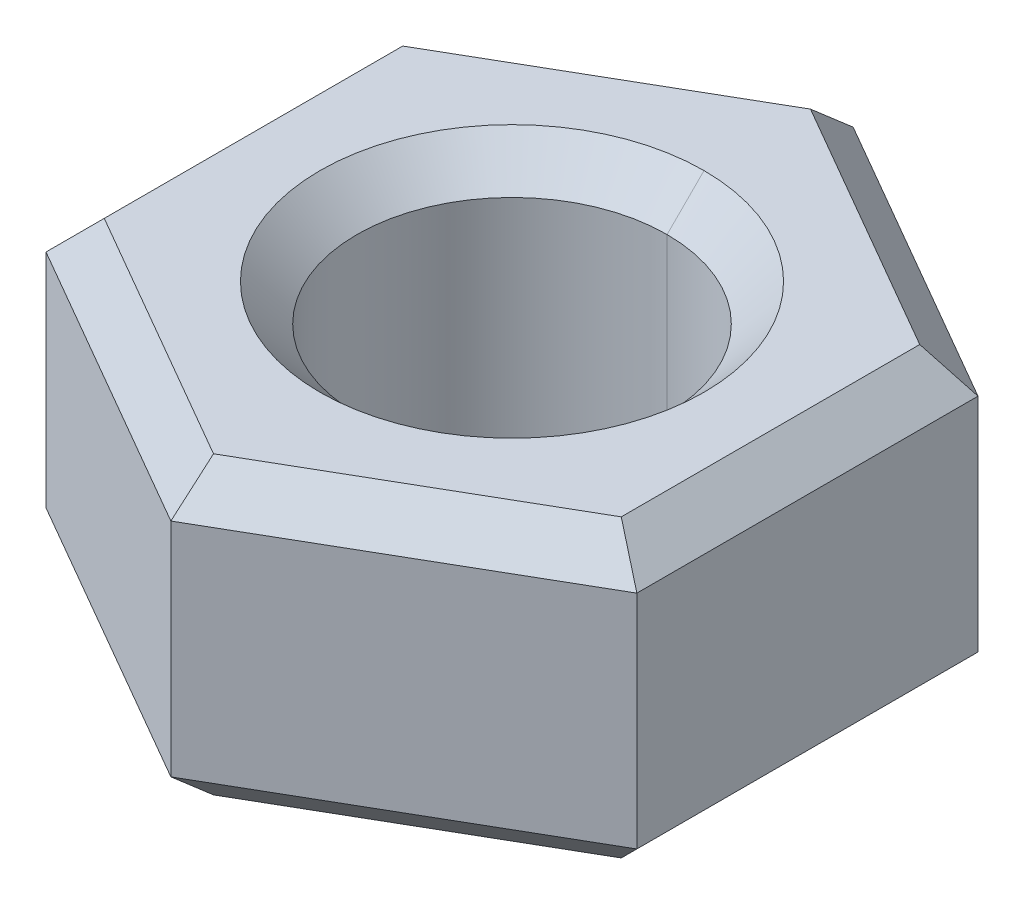
ISO-10303-21;
HEADER;
FILE_DESCRIPTION(('STEP AP214'),'2;1');
FILE_NAME('part.step','',(''),(''),'','','');
FILE_SCHEMA(('AUTOMOTIVE_DESIGN { 1 0 10303 214 1 1 1 1 }'));
ENDSEC;
DATA;
#1=APPLICATION_CONTEXT('core data for automotive mechanical design processes');
#2=APPLICATION_PROTOCOL_DEFINITION('international standard','automotive_design',2000,#1);
#3=PRODUCT_CONTEXT('',#1,'mechanical');
#4=PRODUCT('Part','Part','',(#3));
#5=PRODUCT_RELATED_PRODUCT_CATEGORY('part','',(#4));
#6=PRODUCT_DEFINITION_FORMATION('','',#4);
#7=PRODUCT_DEFINITION_CONTEXT('part definition',#1,'design');
#8=PRODUCT_DEFINITION('design','',#6,#7);
#9=PRODUCT_DEFINITION_SHAPE('','',#8);
#10=(LENGTH_UNIT() NAMED_UNIT(*) SI_UNIT(.MILLI.,.METRE.));
#11=(NAMED_UNIT(*) PLANE_ANGLE_UNIT() SI_UNIT($,.RADIAN.));
#12=(NAMED_UNIT(*) SI_UNIT($,.STERADIAN.) SOLID_ANGLE_UNIT());
#13=UNCERTAINTY_MEASURE_WITH_UNIT(LENGTH_MEASURE(1.E-05),#10,'distance_accuracy_value','');
#14=(GEOMETRIC_REPRESENTATION_CONTEXT(3) GLOBAL_UNCERTAINTY_ASSIGNED_CONTEXT((#13)) GLOBAL_UNIT_ASSIGNED_CONTEXT((#10,
#11,#12)) REPRESENTATION_CONTEXT('',''));
#15=CARTESIAN_POINT('',(0.,0.,0.));
#16=DIRECTION('',(0.,0.,1.));
#17=DIRECTION('',(1.,0.,0.));
#18=AXIS2_PLACEMENT_3D('',#15,#16,#17);
#19=CARTESIAN_POINT('',(0.,4.,-4.61880215351701));
#20=DIRECTION('',(0.,1.,0.));
#21=DIRECTION('',(0.,0.,1.));
#22=AXIS2_PLACEMENT_3D('',#19,#20,#21);
#23=PLANE('',#22);
#24=CARTESIAN_POINT('',(0.,4.00000000007594,0.));
#25=DIRECTION('',(0.,1.,0.));
#26=DIRECTION('',(0.,0.,1.));
#27=AXIS2_PLACEMENT_3D('',#24,#25,#26);
#28=CIRCLE('',#27,2.59999999997262);
#29=CARTESIAN_POINT('',(0.,4.00000000007594,2.59999999997262));
#30=VERTEX_POINT('',#29);
#31=CARTESIAN_POINT('',(0.,4.00000000007594,-2.59999999997262));
#32=VERTEX_POINT('',#31);
#33=EDGE_CURVE('E20',#30,#32,#28,.F.);
#34=ORIENTED_EDGE('',*,*,#33,.T.);
#35=CARTESIAN_POINT('',(0.,4.00000000007594,0.));
#36=DIRECTION('',(0.,1.,0.));
#37=DIRECTION('',(0.,0.,1.));
#38=AXIS2_PLACEMENT_3D('',#35,#36,#37);
#39=CIRCLE('',#38,2.59999999997262);
#40=EDGE_CURVE('E56',#32,#30,#39,.F.);
#41=ORIENTED_EDGE('',*,*,#40,.T.);
#42=EDGE_LOOP('',(#34,#41));
#43=FACE_BOUND('',#42,.T.);
#44=DIRECTION('',(0.866025403784439,0.,0.5));
#45=VECTOR('',#44,1.);
#46=CARTESIAN_POINT('',(0.,4.,-4.04145188432738));
#47=LINE('',#46,#45);
#48=CARTESIAN_POINT('',(0.,4.,-4.04145188432738));
#49=VERTEX_POINT('',#48);
#50=CARTESIAN_POINT('',(3.5,4.,-2.02072594216369));
#51=VERTEX_POINT('',#50);
#52=EDGE_CURVE('E266',#49,#51,#47,.T.);
#53=ORIENTED_EDGE('',*,*,#52,.F.);
#54=DIRECTION('',(0.866025403784439,0.,-0.5));
#55=VECTOR('',#54,1.);
#56=CARTESIAN_POINT('',(-3.5,4.,-2.02072594216369));
#57=LINE('',#56,#55);
#58=CARTESIAN_POINT('',(-3.5,4.,-2.02072594216369));
#59=VERTEX_POINT('',#58);
#60=EDGE_CURVE('E259',#59,#49,#57,.T.);
#61=ORIENTED_EDGE('',*,*,#60,.F.);
#62=DIRECTION('',(0.,0.,1.));
#63=VECTOR('',#62,1.);
#64=CARTESIAN_POINT('',(-3.5,4.,-4.61880215351701));
#65=LINE('',#64,#63);
#66=CARTESIAN_POINT('',(-3.5,4.,2.02072594216369));
#67=VERTEX_POINT('',#66);
#68=EDGE_CURVE('E64',#67,#59,#65,.F.);
#69=ORIENTED_EDGE('',*,*,#68,.F.);
#70=DIRECTION('',(-0.866025403784439,0.,-0.5));
#71=VECTOR('',#70,1.);
#72=CARTESIAN_POINT('',(0.,4.,4.04145188432738));
#73=LINE('',#72,#71);
#74=CARTESIAN_POINT('',(0.,4.,4.04145188432738));
#75=VERTEX_POINT('',#74);
#76=EDGE_CURVE('E281',#75,#67,#73,.T.);
#77=ORIENTED_EDGE('',*,*,#76,.F.);
#78=DIRECTION('',(-0.866025403784439,0.,0.5));
#79=VECTOR('',#78,1.);
#80=CARTESIAN_POINT('',(3.5,4.,2.02072594216369));
#81=LINE('',#80,#79);
#82=CARTESIAN_POINT('',(3.5,4.,2.02072594216369));
#83=VERTEX_POINT('',#82);
#84=EDGE_CURVE('E277',#83,#75,#81,.T.);
#85=ORIENTED_EDGE('',*,*,#84,.F.);
#86=DIRECTION('',(0.,0.,1.));
#87=VECTOR('',#86,1.);
#88=CARTESIAN_POINT('',(3.5,4.,-4.61880215351701));
#89=LINE('',#88,#87);
#90=EDGE_CURVE('E273',#51,#83,#89,.T.);
#91=ORIENTED_EDGE('',*,*,#90,.F.);
#92=EDGE_LOOP('',(#53,#61,#69,#77,#85,#91));
#93=FACE_BOUND('',#92,.T.);
#94=ADVANCED_FACE('F17',(#43,#93),#23,.T.);
#95=CARTESIAN_POINT('',(-3.5,4.,-4.61880215351701));
#96=DIRECTION('',(-0.707106781186549,0.707106781186546,0.));
#97=DIRECTION('',(-0.707106781186546,-0.707106781186549,0.));
#98=AXIS2_PLACEMENT_3D('',#95,#96,#97);
#99=PLANE('',#98);
#100=DIRECTION('',(0.654653670707976,0.654653670707978,0.377964473009228));
#101=VECTOR('',#100,1.);
#102=CARTESIAN_POINT('',(-4.,3.5,-2.30940107675851));
#103=LINE('',#102,#101);
#104=CARTESIAN_POINT('',(-4.,3.5,-2.30940107675851));
#105=VERTEX_POINT('',#104);
#106=EDGE_CURVE('E262',#105,#59,#103,.T.);
#107=ORIENTED_EDGE('',*,*,#106,.F.);
#108=DIRECTION('',(0.,0.,-1.));
#109=VECTOR('',#108,1.);
#110=CARTESIAN_POINT('',(-4.,3.5,-2.3094010767585));
#111=LINE('',#110,#109);
#112=CARTESIAN_POINT('',(-4.,3.5,2.3094010767585));
#113=VERTEX_POINT('',#112);
#114=EDGE_CURVE('E241',#105,#113,#111,.F.);
#115=ORIENTED_EDGE('',*,*,#114,.T.);
#116=DIRECTION('',(-0.654653670707976,-0.654653670707978,0.377964473009227));
#117=VECTOR('',#116,1.);
#118=CARTESIAN_POINT('',(-3.5,4.,2.02072594216369));
#119=LINE('',#118,#117);
#120=EDGE_CURVE('E279',#67,#113,#119,.T.);
#121=ORIENTED_EDGE('',*,*,#120,.F.);
#122=ORIENTED_EDGE('',*,*,#68,.T.);
#123=EDGE_LOOP('',(#107,#115,#121,#122));
#124=FACE_BOUND('',#123,.T.);
#125=ADVANCED_FACE('F412',(#124),#99,.T.);
#126=CARTESIAN_POINT('',(-3.75,4.,1.87638837486628));
#127=DIRECTION('',(-0.353553390593274,0.707106781186546,0.612372435695796));
#128=DIRECTION('',(0.,-0.654653670707978,0.755928946018453));
#129=AXIS2_PLACEMENT_3D('',#126,#127,#128);
#130=PLANE('',#129);
#131=ORIENTED_EDGE('',*,*,#120,.T.);
#132=DIRECTION('',(-0.866025403784439,0.,-0.5));
#133=VECTOR('',#132,1.);
#134=CARTESIAN_POINT('',(-4.,3.5,2.3094010767585));
#135=LINE('',#134,#133);
#136=CARTESIAN_POINT('',(0.,3.5,4.61880215351701));
#137=VERTEX_POINT('',#136);
#138=EDGE_CURVE('E237',#113,#137,#135,.F.);
#139=ORIENTED_EDGE('',*,*,#138,.T.);
#140=DIRECTION('',(0.,-0.654653670707978,0.755928946018454));
#141=VECTOR('',#140,1.);
#142=CARTESIAN_POINT('',(0.,5.07142857142857,2.8042727360639));
#143=LINE('',#142,#141);
#144=EDGE_CURVE('E275',#75,#137,#143,.T.);
#145=ORIENTED_EDGE('',*,*,#144,.F.);
#146=ORIENTED_EDGE('',*,*,#76,.T.);
#147=EDGE_LOOP('',(#131,#139,#145,#146));
#148=FACE_BOUND('',#147,.T.);
#149=ADVANCED_FACE('F409',(#148),#130,.T.);
#150=CARTESIAN_POINT('',(3.75,4.,1.87638837486628));
#151=DIRECTION('',(0.353553390593274,0.707106781186547,0.612372435695795));
#152=DIRECTION('',(0.,-0.654653670707978,0.755928946018454));
#153=AXIS2_PLACEMENT_3D('',#150,#151,#152);
#154=PLANE('',#153);
#155=ORIENTED_EDGE('',*,*,#144,.T.);
#156=DIRECTION('',(-0.866025403784439,0.,0.5));
#157=VECTOR('',#156,1.);
#158=CARTESIAN_POINT('',(0.,3.5,4.61880215351701));
#159=LINE('',#158,#157);
#160=CARTESIAN_POINT('',(4.,3.5,2.3094010767585));
#161=VERTEX_POINT('',#160);
#162=EDGE_CURVE('E166',#137,#161,#159,.F.);
#163=ORIENTED_EDGE('',*,*,#162,.T.);
#164=DIRECTION('',(0.654653670707976,-0.654653670707978,0.377964473009227));
#165=VECTOR('',#164,1.);
#166=CARTESIAN_POINT('',(3.5,4.,2.02072594216369));
#167=LINE('',#166,#165);
#168=EDGE_CURVE('E271',#83,#161,#167,.T.);
#169=ORIENTED_EDGE('',*,*,#168,.F.);
#170=ORIENTED_EDGE('',*,*,#84,.T.);
#171=EDGE_LOOP('',(#155,#163,#169,#170));
#172=FACE_BOUND('',#171,.T.);
#173=ADVANCED_FACE('F405',(#172),#154,.T.);
#174=CARTESIAN_POINT('',(3.5,4.,-4.61880215351701));
#175=DIRECTION('',(0.707106781186549,0.707106781186546,0.));
#176=DIRECTION('',(-0.707106781186546,0.707106781186549,0.));
#177=AXIS2_PLACEMENT_3D('',#174,#175,#176);
#178=PLANE('',#177);
#179=ORIENTED_EDGE('',*,*,#168,.T.);
#180=DIRECTION('',(0.,0.,1.));
#181=VECTOR('',#180,1.);
#182=CARTESIAN_POINT('',(4.,3.5,2.3094010767585));
#183=LINE('',#182,#181);
#184=CARTESIAN_POINT('',(4.,3.5,-2.3094010767585));
#185=VERTEX_POINT('',#184);
#186=EDGE_CURVE('E163',#161,#185,#183,.F.);
#187=ORIENTED_EDGE('',*,*,#186,.T.);
#188=DIRECTION('',(0.654653670707977,-0.654653670707978,-0.377964473009227));
#189=VECTOR('',#188,1.);
#190=CARTESIAN_POINT('',(3.5,4.,-2.02072594216369));
#191=LINE('',#190,#189);
#192=EDGE_CURVE('E269',#51,#185,#191,.T.);
#193=ORIENTED_EDGE('',*,*,#192,.F.);
#194=ORIENTED_EDGE('',*,*,#90,.T.);
#195=EDGE_LOOP('',(#179,#187,#193,#194));
#196=FACE_BOUND('',#195,.T.);
#197=ADVANCED_FACE('F401',(#196),#178,.T.);
#198=CARTESIAN_POINT('',(-0.25,4.,-4.18578945162479));
#199=DIRECTION('',(0.353553390593275,0.707106781186546,-0.612372435695796));
#200=DIRECTION('',(0.,0.654653670707979,0.755928946018453));
#201=AXIS2_PLACEMENT_3D('',#198,#199,#200);
#202=PLANE('',#201);
#203=DIRECTION('',(0.,0.654653670707978,0.755928946018454));
#204=VECTOR('',#203,1.);
#205=CARTESIAN_POINT('',(0.,3.92857142857143,-4.12393049421161));
#206=LINE('',#205,#204);
#207=CARTESIAN_POINT('',(0.,3.5,-4.61880215351701));
#208=VERTEX_POINT('',#207);
#209=EDGE_CURVE('E264',#49,#208,#206,.F.);
#210=ORIENTED_EDGE('',*,*,#209,.F.);
#211=ORIENTED_EDGE('',*,*,#52,.T.);
#212=ORIENTED_EDGE('',*,*,#192,.T.);
#213=DIRECTION('',(0.866025403784439,0.,0.5));
#214=VECTOR('',#213,1.);
#215=CARTESIAN_POINT('',(4.,3.5,-2.3094010767585));
#216=LINE('',#215,#214);
#217=EDGE_CURVE('E228',#185,#208,#216,.F.);
#218=ORIENTED_EDGE('',*,*,#217,.T.);
#219=EDGE_LOOP('',(#210,#211,#212,#218));
#220=FACE_BOUND('',#219,.T.);
#221=ADVANCED_FACE('F397',(#220),#202,.T.);
#222=CARTESIAN_POINT('',(0.250000000000002,4.,-4.18578945162479));
#223=DIRECTION('',(-0.353553390593274,0.707106781186547,-0.612372435695795));
#224=DIRECTION('',(0.,0.654653670707978,0.755928946018454));
#225=AXIS2_PLACEMENT_3D('',#222,#223,#224);
#226=PLANE('',#225);
#227=ORIENTED_EDGE('',*,*,#106,.T.);
#228=ORIENTED_EDGE('',*,*,#60,.T.);
#229=ORIENTED_EDGE('',*,*,#209,.T.);
#230=DIRECTION('',(0.866025403784439,0.,-0.5));
#231=VECTOR('',#230,1.);
#232=CARTESIAN_POINT('',(0.,3.5,-4.61880215351701));
#233=LINE('',#232,#231);
#234=EDGE_CURVE('E222',#208,#105,#233,.F.);
#235=ORIENTED_EDGE('',*,*,#234,.T.);
#236=EDGE_LOOP('',(#227,#228,#229,#235));
#237=FACE_BOUND('',#236,.T.);
#238=ADVANCED_FACE('F394',(#237),#226,.T.);
#239=CARTESIAN_POINT('',(0.,4.00000000007594,0.));
#240=DIRECTION('',(0.,1.,0.));
#241=DIRECTION('',(0.,0.,1.));
#242=AXIS2_PLACEMENT_3D('',#239,#240,#241);
#243=CONICAL_SURFACE('',#242,2.59999999997262,0.785398163397448);
#244=DIRECTION('',(0.,-0.707106781186548,0.707106781186547));
#245=VECTOR('',#244,1.);
#246=CARTESIAN_POINT('',(6.1109703826901E-11,499000.,-498998.6));
#247=LINE('',#246,#245);
#248=CARTESIAN_POINT('',(0.,3.49999999999352,-2.0999999999819));
#249=VERTEX_POINT('',#248);
#250=EDGE_CURVE('E244',#249,#32,#247,.F.);
#251=ORIENTED_EDGE('',*,*,#250,.T.);
#252=ORIENTED_EDGE('',*,*,#33,.F.);
#253=DIRECTION('',(0.,-0.707106781186548,-0.707106781186547));
#254=VECTOR('',#253,1.);
#255=CARTESIAN_POINT('',(0.,499000.,498998.6));
#256=LINE('',#255,#254);
#257=CARTESIAN_POINT('',(0.,3.50000000002194,2.09999999999611));
#258=VERTEX_POINT('',#257);
#259=EDGE_CURVE('E252',#30,#258,#256,.T.);
#260=ORIENTED_EDGE('',*,*,#259,.T.);
#261=CARTESIAN_POINT('',(0.,3.5,0.));
#262=DIRECTION('',(0.,-1.,0.));
#263=DIRECTION('',(0.,0.,-1.));
#264=AXIS2_PLACEMENT_3D('',#261,#262,#263);
#265=CIRCLE('',#264,2.1);
#266=EDGE_CURVE('E93',#258,#249,#265,.T.);
#267=ORIENTED_EDGE('',*,*,#266,.T.);
#268=EDGE_LOOP('',(#251,#252,#260,#267));
#269=FACE_BOUND('',#268,.T.);
#270=ADVANCED_FACE('F288',(#269),#243,.F.);
#271=CARTESIAN_POINT('',(0.,4.00000000007594,0.));
#272=DIRECTION('',(0.,1.,0.));
#273=DIRECTION('',(0.,0.,1.));
#274=AXIS2_PLACEMENT_3D('',#271,#272,#273);
#275=CONICAL_SURFACE('',#274,2.59999999997262,0.785398163397448);
#276=CARTESIAN_POINT('',(0.,3.5,0.));
#277=DIRECTION('',(0.,-1.,0.));
#278=DIRECTION('',(0.,0.,-1.));
#279=AXIS2_PLACEMENT_3D('',#276,#277,#278);
#280=CIRCLE('',#279,2.1);
#281=EDGE_CURVE('E214',#249,#258,#280,.T.);
#282=ORIENTED_EDGE('',*,*,#281,.T.);
#283=ORIENTED_EDGE('',*,*,#259,.F.);
#284=ORIENTED_EDGE('',*,*,#40,.F.);
#285=ORIENTED_EDGE('',*,*,#250,.F.);
#286=EDGE_LOOP('',(#282,#283,#284,#285));
#287=FACE_BOUND('',#286,.T.);
#288=ADVANCED_FACE('F289',(#287),#275,.F.);
#289=CARTESIAN_POINT('',(-4.,4.,-2.3094010767585));
#290=DIRECTION('',(1.,0.,0.));
#291=DIRECTION('',(0.,0.,-1.));
#292=AXIS2_PLACEMENT_3D('',#289,#290,#291);
#293=PLANE('',#292);
#294=DIRECTION('',(0.,1.,0.));
#295=VECTOR('',#294,1.);
#296=CARTESIAN_POINT('',(-4.,4.,2.3094010767585));
#297=LINE('',#296,#295);
#298=CARTESIAN_POINT('',(-4.,0.499999999999999,2.30940107675851));
#299=VERTEX_POINT('',#298);
#300=EDGE_CURVE('E101',#299,#113,#297,.T.);
#301=ORIENTED_EDGE('',*,*,#300,.T.);
#302=ORIENTED_EDGE('',*,*,#114,.F.);
#303=DIRECTION('',(0.,1.,0.));
#304=VECTOR('',#303,1.);
#305=CARTESIAN_POINT('',(-4.,4.,-2.30940107675851));
#306=LINE('',#305,#304);
#307=CARTESIAN_POINT('',(-4.,0.499999999999999,-2.30940107675851));
#308=VERTEX_POINT('',#307);
#309=EDGE_CURVE('E220',#105,#308,#306,.F.);
#310=ORIENTED_EDGE('',*,*,#309,.T.);
#311=DIRECTION('',(0.,0.,1.));
#312=VECTOR('',#311,1.);
#313=CARTESIAN_POINT('',(-4.,0.499999999999999,-2.3094010767585));
#314=LINE('',#313,#312);
#315=EDGE_CURVE('E142',#308,#299,#314,.T.);
#316=ORIENTED_EDGE('',*,*,#315,.T.);
#317=EDGE_LOOP('',(#301,#302,#310,#316));
#318=FACE_BOUND('',#317,.T.);
#319=ADVANCED_FACE('F386',(#318),#293,.F.);
#320=CARTESIAN_POINT('',(-4.,4.,2.3094010767585));
#321=DIRECTION('',(0.5,0.,-0.866025403784439));
#322=DIRECTION('',(-0.866025403784439,0.,-0.5));
#323=AXIS2_PLACEMENT_3D('',#320,#321,#322);
#324=PLANE('',#323);
#325=DIRECTION('',(0.,1.,0.));
#326=VECTOR('',#325,1.);
#327=CARTESIAN_POINT('',(0.,4.,4.61880215351701));
#328=LINE('',#327,#326);
#329=CARTESIAN_POINT('',(0.,0.499999999999999,4.61880215351701));
#330=VERTEX_POINT('',#329);
#331=EDGE_CURVE('E172',#330,#137,#328,.T.);
#332=ORIENTED_EDGE('',*,*,#331,.T.);
#333=ORIENTED_EDGE('',*,*,#138,.F.);
#334=ORIENTED_EDGE('',*,*,#300,.F.);
#335=DIRECTION('',(0.866025403784439,0.,0.5));
#336=VECTOR('',#335,1.);
#337=CARTESIAN_POINT('',(-4.,0.499999999999999,2.3094010767585));
#338=LINE('',#337,#336);
#339=EDGE_CURVE('E198',#299,#330,#338,.T.);
#340=ORIENTED_EDGE('',*,*,#339,.T.);
#341=EDGE_LOOP('',(#332,#333,#334,#340));
#342=FACE_BOUND('',#341,.T.);
#343=ADVANCED_FACE('F383',(#342),#324,.F.);
#344=CARTESIAN_POINT('',(0.,4.,4.61880215351701));
#345=DIRECTION('',(-0.5,0.,-0.866025403784439));
#346=DIRECTION('',(-0.866025403784439,0.,0.5));
#347=AXIS2_PLACEMENT_3D('',#344,#345,#346);
#348=PLANE('',#347);
#349=DIRECTION('',(0.,1.,0.));
#350=VECTOR('',#349,1.);
#351=CARTESIAN_POINT('',(4.,4.,2.3094010767585));
#352=LINE('',#351,#350);
#353=CARTESIAN_POINT('',(4.,0.499999999999999,2.30940107675851));
#354=VERTEX_POINT('',#353);
#355=EDGE_CURVE('E155',#354,#161,#352,.T.);
#356=ORIENTED_EDGE('',*,*,#355,.T.);
#357=ORIENTED_EDGE('',*,*,#162,.F.);
#358=ORIENTED_EDGE('',*,*,#331,.F.);
#359=DIRECTION('',(0.866025403784439,0.,-0.5));
#360=VECTOR('',#359,1.);
#361=CARTESIAN_POINT('',(0.,0.499999999999998,4.61880215351701));
#362=LINE('',#361,#360);
#363=EDGE_CURVE('E169',#330,#354,#362,.T.);
#364=ORIENTED_EDGE('',*,*,#363,.T.);
#365=EDGE_LOOP('',(#356,#357,#358,#364));
#366=FACE_BOUND('',#365,.T.);
#367=ADVANCED_FACE('F170',(#366),#348,.F.);
#368=CARTESIAN_POINT('',(4.,4.,2.3094010767585));
#369=DIRECTION('',(-1.,0.,0.));
#370=DIRECTION('',(0.,0.,1.));
#371=AXIS2_PLACEMENT_3D('',#368,#369,#370);
#372=PLANE('',#371);
#373=DIRECTION('',(0.,1.,0.));
#374=VECTOR('',#373,1.);
#375=CARTESIAN_POINT('',(4.,4.,-2.3094010767585));
#376=LINE('',#375,#374);
#377=CARTESIAN_POINT('',(4.,0.499999999999999,-2.3094010767585));
#378=VERTEX_POINT('',#377);
#379=EDGE_CURVE('E231',#378,#185,#376,.T.);
#380=ORIENTED_EDGE('',*,*,#379,.T.);
#381=ORIENTED_EDGE('',*,*,#186,.F.);
#382=ORIENTED_EDGE('',*,*,#355,.F.);
#383=DIRECTION('',(0.,0.,1.));
#384=VECTOR('',#383,1.);
#385=CARTESIAN_POINT('',(4.,0.499999999999999,2.3094010767585));
#386=LINE('',#385,#384);
#387=EDGE_CURVE('E160',#354,#378,#386,.F.);
#388=ORIENTED_EDGE('',*,*,#387,.T.);
#389=EDGE_LOOP('',(#380,#381,#382,#388));
#390=FACE_BOUND('',#389,.T.);
#391=ADVANCED_FACE('F158',(#390),#372,.F.);
#392=CARTESIAN_POINT('',(4.,4.,-2.3094010767585));
#393=DIRECTION('',(-0.5,0.,0.866025403784439));
#394=DIRECTION('',(0.866025403784439,0.,0.5));
#395=AXIS2_PLACEMENT_3D('',#392,#393,#394);
#396=PLANE('',#395);
#397=DIRECTION('',(0.,1.,0.));
#398=VECTOR('',#397,1.);
#399=CARTESIAN_POINT('',(0.,4.,-4.61880215351701));
#400=LINE('',#399,#398);
#401=CARTESIAN_POINT('',(0.,0.499999999999998,-4.61880215351701));
#402=VERTEX_POINT('',#401);
#403=EDGE_CURVE('E225',#402,#208,#400,.T.);
#404=ORIENTED_EDGE('',*,*,#403,.T.);
#405=ORIENTED_EDGE('',*,*,#217,.F.);
#406=ORIENTED_EDGE('',*,*,#379,.F.);
#407=DIRECTION('',(-0.866025403784438,0.,-0.5));
#408=VECTOR('',#407,1.);
#409=CARTESIAN_POINT('',(4.,0.499999999999999,-2.3094010767585));
#410=LINE('',#409,#408);
#411=EDGE_CURVE('E310',#378,#402,#410,.T.);
#412=ORIENTED_EDGE('',*,*,#411,.T.);
#413=EDGE_LOOP('',(#404,#405,#406,#412));
#414=FACE_BOUND('',#413,.T.);
#415=ADVANCED_FACE('F314',(#414),#396,.F.);
#416=CARTESIAN_POINT('',(0.,4.,-4.61880215351701));
#417=DIRECTION('',(0.5,0.,0.866025403784439));
#418=DIRECTION('',(0.866025403784439,0.,-0.5));
#419=AXIS2_PLACEMENT_3D('',#416,#417,#418);
#420=PLANE('',#419);
#421=ORIENTED_EDGE('',*,*,#309,.F.);
#422=ORIENTED_EDGE('',*,*,#234,.F.);
#423=ORIENTED_EDGE('',*,*,#403,.F.);
#424=DIRECTION('',(-0.866025403784439,0.,0.5));
#425=VECTOR('',#424,1.);
#426=CARTESIAN_POINT('',(0.,0.499999999999999,-4.61880215351701));
#427=LINE('',#426,#425);
#428=EDGE_CURVE('E304',#402,#308,#427,.T.);
#429=ORIENTED_EDGE('',*,*,#428,.T.);
#430=EDGE_LOOP('',(#421,#422,#423,#429));
#431=FACE_BOUND('',#430,.T.);
#432=ADVANCED_FACE('F374',(#431),#420,.F.);
#433=CARTESIAN_POINT('',(0.,4.,0.));
#434=DIRECTION('',(0.,-1.,0.));
#435=DIRECTION('',(0.,0.,-1.));
#436=AXIS2_PLACEMENT_3D('',#433,#434,#435);
#437=CYLINDRICAL_SURFACE('',#436,2.1);
#438=DIRECTION('',(0.,-1.,0.));
#439=VECTOR('',#438,1.);
#440=CARTESIAN_POINT('',(0.,4.,2.1));
#441=LINE('',#440,#439);
#442=CARTESIAN_POINT('',(0.,0.500000000073442,2.09999999997413));
#443=VERTEX_POINT('',#442);
#444=EDGE_CURVE('E203',#258,#443,#441,.T.);
#445=ORIENTED_EDGE('',*,*,#444,.T.);
#446=CARTESIAN_POINT('',(0.,0.50000000004502,0.));
#447=DIRECTION('',(0.,-1.,0.));
#448=DIRECTION('',(0.,0.,-1.));
#449=AXIS2_PLACEMENT_3D('',#446,#447,#448);
#450=CIRCLE('',#449,2.09999999998445);
#451=CARTESIAN_POINT('',(0.,0.500000000087653,-2.09999999997413));
#452=VERTEX_POINT('',#451);
#453=EDGE_CURVE('E126',#443,#452,#450,.T.);
#454=ORIENTED_EDGE('',*,*,#453,.T.);
#455=DIRECTION('',(0.,-1.,0.));
#456=VECTOR('',#455,1.);
#457=CARTESIAN_POINT('',(0.,4.,-2.1));
#458=LINE('',#457,#456);
#459=EDGE_CURVE('E135',#452,#249,#458,.F.);
#460=ORIENTED_EDGE('',*,*,#459,.T.);
#461=ORIENTED_EDGE('',*,*,#266,.F.);
#462=EDGE_LOOP('',(#445,#454,#460,#461));
#463=FACE_BOUND('',#462,.T.);
#464=ADVANCED_FACE('F292',(#463),#437,.F.);
#465=CARTESIAN_POINT('',(0.,4.,0.));
#466=DIRECTION('',(0.,-1.,0.));
#467=DIRECTION('',(0.,0.,-1.));
#468=AXIS2_PLACEMENT_3D('',#465,#466,#467);
#469=CYLINDRICAL_SURFACE('',#468,2.1);
#470=ORIENTED_EDGE('',*,*,#281,.F.);
#471=ORIENTED_EDGE('',*,*,#459,.F.);
#472=CARTESIAN_POINT('',(0.,0.50000000004502,0.));
#473=DIRECTION('',(0.,-1.,0.));
#474=DIRECTION('',(0.,0.,-1.));
#475=AXIS2_PLACEMENT_3D('',#472,#473,#474);
#476=CIRCLE('',#475,2.09999999998445);
#477=EDGE_CURVE('E208',#452,#443,#476,.T.);
#478=ORIENTED_EDGE('',*,*,#477,.T.);
#479=ORIENTED_EDGE('',*,*,#444,.F.);
#480=EDGE_LOOP('',(#470,#471,#478,#479));
#481=FACE_BOUND('',#480,.T.);
#482=ADVANCED_FACE('F291',(#481),#469,.F.);
#483=CARTESIAN_POINT('',(-4.,0.499999999999999,-2.3094010767585));
#484=DIRECTION('',(0.707106781186546,0.707106781186549,0.));
#485=DIRECTION('',(-0.707106781186549,0.707106781186546,0.));
#486=AXIS2_PLACEMENT_3D('',#483,#484,#485);
#487=PLANE('',#486);
#488=DIRECTION('',(0.654653670707978,-0.654653670707975,0.377964473009228));
#489=VECTOR('',#488,1.);
#490=CARTESIAN_POINT('',(-4.,0.499999999999998,-2.30940107675851));
#491=LINE('',#490,#489);
#492=CARTESIAN_POINT('',(-3.5,0.,-2.02072594216369));
#493=VERTEX_POINT('',#492);
#494=EDGE_CURVE('E205',#308,#493,#491,.T.);
#495=ORIENTED_EDGE('',*,*,#494,.T.);
#496=DIRECTION('',(0.,0.,1.));
#497=VECTOR('',#496,1.);
#498=CARTESIAN_POINT('',(-3.5,0.,-4.61880215351701));
#499=LINE('',#498,#497);
#500=CARTESIAN_POINT('',(-3.5,0.,2.02072594216369));
#501=VERTEX_POINT('',#500);
#502=EDGE_CURVE('E341',#493,#501,#499,.T.);
#503=ORIENTED_EDGE('',*,*,#502,.T.);
#504=DIRECTION('',(-0.654653670707979,0.654653670707976,0.377964473009227));
#505=VECTOR('',#504,1.);
#506=CARTESIAN_POINT('',(-3.5,0.,2.02072594216369));
#507=LINE('',#506,#505);
#508=EDGE_CURVE('E200',#501,#299,#507,.T.);
#509=ORIENTED_EDGE('',*,*,#508,.T.);
#510=ORIENTED_EDGE('',*,*,#315,.F.);
#511=EDGE_LOOP('',(#495,#503,#509,#510));
#512=FACE_BOUND('',#511,.T.);
#513=ADVANCED_FACE('F366',(#512),#487,.F.);
#514=CARTESIAN_POINT('',(-4.,0.499999999999999,2.3094010767585));
#515=DIRECTION('',(0.353553390593273,0.707106781186549,-0.612372435695794));
#516=DIRECTION('',(0.,0.654653670707976,0.755928946018456));
#517=AXIS2_PLACEMENT_3D('',#514,#515,#516);
#518=PLANE('',#517);
#519=ORIENTED_EDGE('',*,*,#508,.F.);
#520=DIRECTION('',(0.866025403784439,0.,0.5));
#521=VECTOR('',#520,1.);
#522=CARTESIAN_POINT('',(-3.5,0.,2.02072594216369));
#523=LINE('',#522,#521);
#524=CARTESIAN_POINT('',(0.,0.,4.04145188432738));
#525=VERTEX_POINT('',#524);
#526=EDGE_CURVE('E338',#501,#525,#523,.T.);
#527=ORIENTED_EDGE('',*,*,#526,.T.);
#528=DIRECTION('',(0.,0.654653670707977,0.755928946018455));
#529=VECTOR('',#528,1.);
#530=CARTESIAN_POINT('',(0.,0.499999999999999,4.61880215351701));
#531=LINE('',#530,#529);
#532=EDGE_CURVE('E178',#525,#330,#531,.T.);
#533=ORIENTED_EDGE('',*,*,#532,.T.);
#534=ORIENTED_EDGE('',*,*,#339,.F.);
#535=EDGE_LOOP('',(#519,#527,#533,#534));
#536=FACE_BOUND('',#535,.T.);
#537=ADVANCED_FACE('F363',(#536),#518,.F.);
#538=CARTESIAN_POINT('',(0.,0.499999999999999,4.61880215351701));
#539=DIRECTION('',(-0.353553390593273,0.707106781186548,-0.612372435695794));
#540=DIRECTION('',(0.,0.654653670707977,0.755928946018455));
#541=AXIS2_PLACEMENT_3D('',#538,#539,#540);
#542=PLANE('',#541);
#543=DIRECTION('',(0.654653670707978,0.654653670707976,0.377964473009228));
#544=VECTOR('',#543,1.);
#545=CARTESIAN_POINT('',(3.5,0.,2.02072594216369));
#546=LINE('',#545,#544);
#547=CARTESIAN_POINT('',(3.5,0.,2.02072594216369));
#548=VERTEX_POINT('',#547);
#549=EDGE_CURVE('E177',#548,#354,#546,.T.);
#550=ORIENTED_EDGE('',*,*,#549,.T.);
#551=ORIENTED_EDGE('',*,*,#363,.F.);
#552=ORIENTED_EDGE('',*,*,#532,.F.);
#553=DIRECTION('',(0.866025403784438,0.,-0.5));
#554=VECTOR('',#553,1.);
#555=CARTESIAN_POINT('',(0.,0.,4.04145188432738));
#556=LINE('',#555,#554);
#557=EDGE_CURVE('E193',#525,#548,#556,.T.);
#558=ORIENTED_EDGE('',*,*,#557,.T.);
#559=EDGE_LOOP('',(#550,#551,#552,#558));
#560=FACE_BOUND('',#559,.T.);
#561=ADVANCED_FACE('F191',(#560),#542,.F.);
#562=CARTESIAN_POINT('',(4.,0.499999999999999,2.3094010767585));
#563=DIRECTION('',(-0.707106781186546,0.707106781186549,0.));
#564=DIRECTION('',(-0.707106781186549,-0.707106781186546,0.));
#565=AXIS2_PLACEMENT_3D('',#562,#563,#564);
#566=PLANE('',#565);
#567=DIRECTION('',(0.654653670707979,0.654653670707976,-0.377964473009227));
#568=VECTOR('',#567,1.);
#569=CARTESIAN_POINT('',(3.5,0.,-2.02072594216369));
#570=LINE('',#569,#568);
#571=CARTESIAN_POINT('',(3.5,0.,-2.02072594216369));
#572=VERTEX_POINT('',#571);
#573=EDGE_CURVE('E188',#572,#378,#570,.T.);
#574=ORIENTED_EDGE('',*,*,#573,.T.);
#575=ORIENTED_EDGE('',*,*,#387,.F.);
#576=ORIENTED_EDGE('',*,*,#549,.F.);
#577=DIRECTION('',(0.,0.,1.));
#578=VECTOR('',#577,1.);
#579=CARTESIAN_POINT('',(3.5,0.,-4.61880215351701));
#580=LINE('',#579,#578);
#581=EDGE_CURVE('E332',#548,#572,#580,.F.);
#582=ORIENTED_EDGE('',*,*,#581,.T.);
#583=EDGE_LOOP('',(#574,#575,#576,#582));
#584=FACE_BOUND('',#583,.T.);
#585=ADVANCED_FACE('F183',(#584),#566,.F.);
#586=CARTESIAN_POINT('',(4.,0.499999999999999,-2.3094010767585));
#587=DIRECTION('',(-0.353553390593273,0.707106781186548,0.612372435695794));
#588=DIRECTION('',(0.,-0.654653670707976,0.755928946018455));
#589=AXIS2_PLACEMENT_3D('',#586,#587,#588);
#590=PLANE('',#589);
#591=DIRECTION('',(0.,-0.654653670707976,0.755928946018456));
#592=VECTOR('',#591,1.);
#593=CARTESIAN_POINT('',(0.,0.499999999999999,-4.61880215351701));
#594=LINE('',#593,#592);
#595=CARTESIAN_POINT('',(0.,0.,-4.04145188432738));
#596=VERTEX_POINT('',#595);
#597=EDGE_CURVE('E307',#596,#402,#594,.F.);
#598=ORIENTED_EDGE('',*,*,#597,.T.);
#599=ORIENTED_EDGE('',*,*,#411,.F.);
#600=ORIENTED_EDGE('',*,*,#573,.F.);
#601=DIRECTION('',(-0.866025403784439,0.,-0.5));
#602=VECTOR('',#601,1.);
#603=CARTESIAN_POINT('',(3.5,0.,-2.02072594216369));
#604=LINE('',#603,#602);
#605=EDGE_CURVE('E328',#572,#596,#604,.T.);
#606=ORIENTED_EDGE('',*,*,#605,.T.);
#607=EDGE_LOOP('',(#598,#599,#600,#606));
#608=FACE_BOUND('',#607,.T.);
#609=ADVANCED_FACE('F326',(#608),#590,.F.);
#610=CARTESIAN_POINT('',(0.,0.499999999999999,-4.61880215351701));
#611=DIRECTION('',(0.353553390593273,0.707106781186549,0.612372435695793));
#612=DIRECTION('',(0.,-0.654653670707976,0.755928946018456));
#613=AXIS2_PLACEMENT_3D('',#610,#611,#612);
#614=PLANE('',#613);
#615=ORIENTED_EDGE('',*,*,#494,.F.);
#616=ORIENTED_EDGE('',*,*,#428,.F.);
#617=ORIENTED_EDGE('',*,*,#597,.F.);
#618=DIRECTION('',(-0.866025403784439,0.,0.5));
#619=VECTOR('',#618,1.);
#620=CARTESIAN_POINT('',(0.,0.,-4.04145188432738));
#621=LINE('',#620,#619);
#622=EDGE_CURVE('E285',#596,#493,#621,.T.);
#623=ORIENTED_EDGE('',*,*,#622,.T.);
#624=EDGE_LOOP('',(#615,#616,#617,#623));
#625=FACE_BOUND('',#624,.T.);
#626=ADVANCED_FACE('F320',(#625),#614,.F.);
#627=CARTESIAN_POINT('',(0.,1.13686837721616E-10,0.));
#628=DIRECTION('',(0.,-1.,0.));
#629=DIRECTION('',(0.,0.,-1.));
#630=AXIS2_PLACEMENT_3D('',#627,#628,#629);
#631=CONICAL_SURFACE('',#630,2.59999999991578,0.785398163340605);
#632=DIRECTION('',(0.,0.707106781226742,-0.707106781146353));
#633=VECTOR('',#632,1.);
#634=CARTESIAN_POINT('',(6.11098752774529E-11,-498997.40005673,499000.));
#635=LINE('',#634,#633);
#636=CARTESIAN_POINT('',(0.,5.6843418860808E-11,2.59999999997262));
#637=VERTEX_POINT('',#636);
#638=EDGE_CURVE('E210',#443,#637,#635,.F.);
#639=ORIENTED_EDGE('',*,*,#638,.T.);
#640=CARTESIAN_POINT('',(0.,5.6843418860808E-11,0.));
#641=DIRECTION('',(0.,-1.,0.));
#642=DIRECTION('',(0.,0.,-1.));
#643=AXIS2_PLACEMENT_3D('',#640,#641,#642);
#644=CIRCLE('',#643,2.59999999997262);
#645=CARTESIAN_POINT('',(0.,5.6843418860808E-11,-2.59999999997262));
#646=VERTEX_POINT('',#645);
#647=EDGE_CURVE('E26',#637,#646,#644,.T.);
#648=ORIENTED_EDGE('',*,*,#647,.T.);
#649=DIRECTION('',(0.,0.707106781226742,0.707106781146353));
#650=VECTOR('',#649,1.);
#651=CARTESIAN_POINT('',(0.,-498997.40005673,-499000.));
#652=LINE('',#651,#650);
#653=EDGE_CURVE('E34',#646,#452,#652,.T.);
#654=ORIENTED_EDGE('',*,*,#653,.T.);
#655=ORIENTED_EDGE('',*,*,#453,.F.);
#656=EDGE_LOOP('',(#639,#648,#654,#655));
#657=FACE_BOUND('',#656,.T.);
#658=ADVANCED_FACE('F295',(#657),#631,.F.);
#659=CARTESIAN_POINT('',(0.,1.13686837721616E-10,0.));
#660=DIRECTION('',(0.,-1.,0.));
#661=DIRECTION('',(0.,0.,-1.));
#662=AXIS2_PLACEMENT_3D('',#659,#660,#661);
#663=CONICAL_SURFACE('',#662,2.59999999991578,0.785398163340605);
#664=ORIENTED_EDGE('',*,*,#477,.F.);
#665=ORIENTED_EDGE('',*,*,#653,.F.);
#666=CARTESIAN_POINT('',(0.,5.6843418860808E-11,0.));
#667=DIRECTION('',(0.,-1.,0.));
#668=DIRECTION('',(0.,0.,-1.));
#669=AXIS2_PLACEMENT_3D('',#666,#667,#668);
#670=CIRCLE('',#669,2.59999999997262);
#671=EDGE_CURVE('E11',#646,#637,#670,.T.);
#672=ORIENTED_EDGE('',*,*,#671,.T.);
#673=ORIENTED_EDGE('',*,*,#638,.F.);
#674=EDGE_LOOP('',(#664,#665,#672,#673));
#675=FACE_BOUND('',#674,.T.);
#676=ADVANCED_FACE('F294',(#675),#663,.F.);
#677=CARTESIAN_POINT('',(0.,0.,-4.61880215351701));
#678=DIRECTION('',(0.,1.,0.));
#679=DIRECTION('',(0.,0.,1.));
#680=AXIS2_PLACEMENT_3D('',#677,#678,#679);
#681=PLANE('',#680);
#682=ORIENTED_EDGE('',*,*,#647,.F.);
#683=ORIENTED_EDGE('',*,*,#671,.F.);
#684=EDGE_LOOP('',(#682,#683));
#685=FACE_BOUND('',#684,.T.);
#686=ORIENTED_EDGE('',*,*,#605,.F.);
#687=ORIENTED_EDGE('',*,*,#581,.F.);
#688=ORIENTED_EDGE('',*,*,#557,.F.);
#689=ORIENTED_EDGE('',*,*,#526,.F.);
#690=ORIENTED_EDGE('',*,*,#502,.F.);
#691=ORIENTED_EDGE('',*,*,#622,.F.);
#692=EDGE_LOOP('',(#686,#687,#688,#689,#690,#691));
#693=FACE_BOUND('',#692,.T.);
#694=ADVANCED_FACE('F344',(#685,#693),#681,.F.);
#695=CLOSED_SHELL('',(#94,#125,#149,#173,#197,#221,#238,#270,#288,#319,#343,#367,#391,#415,#432,
#464,#482,#513,#537,#561,#585,#609,#626,#658,#676,#694));
#696=MANIFOLD_SOLID_BREP('B1',#695);
#697=ADVANCED_BREP_SHAPE_REPRESENTATION('',(#18,#696),#14);
#698=SHAPE_DEFINITION_REPRESENTATION(#9,#697);
ENDSEC;
END-ISO-10303-21;
